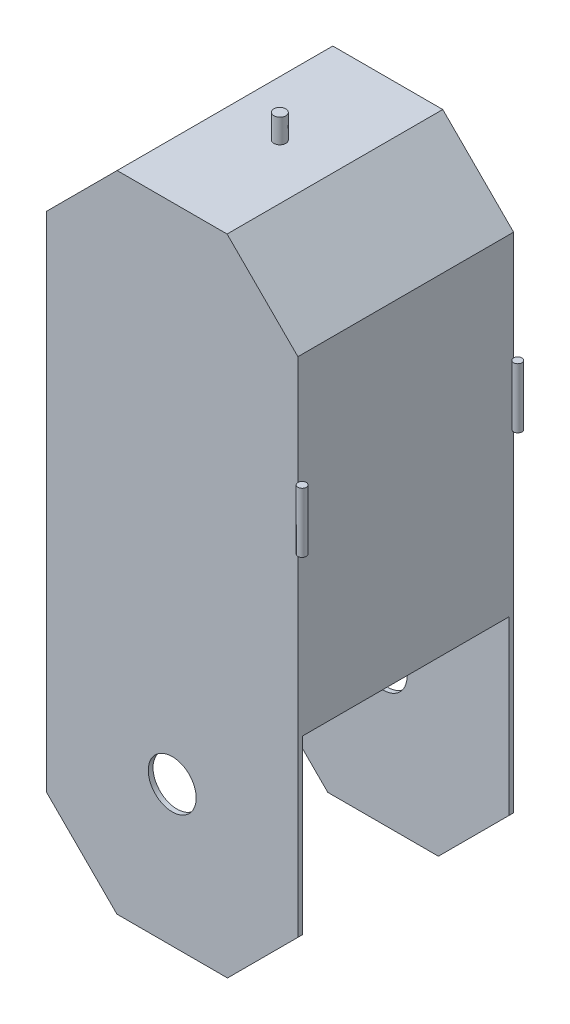
ISO-10303-21;
HEADER;
FILE_DESCRIPTION(('STEP AP214'),'2;1');
FILE_NAME('part.step','',(''),(''),'','','');
FILE_SCHEMA(('AUTOMOTIVE_DESIGN { 1 0 10303 214 1 1 1 1 }'));
ENDSEC;
DATA;
#1=APPLICATION_CONTEXT('core data for automotive mechanical design processes');
#2=APPLICATION_PROTOCOL_DEFINITION('international standard','automotive_design',2000,#1);
#3=PRODUCT_CONTEXT('',#1,'mechanical');
#4=PRODUCT('Part','Part','',(#3));
#5=PRODUCT_RELATED_PRODUCT_CATEGORY('part','',(#4));
#6=PRODUCT_DEFINITION_FORMATION('','',#4);
#7=PRODUCT_DEFINITION_CONTEXT('part definition',#1,'design');
#8=PRODUCT_DEFINITION('design','',#6,#7);
#9=PRODUCT_DEFINITION_SHAPE('','',#8);
#10=(LENGTH_UNIT() NAMED_UNIT(*) SI_UNIT(.MILLI.,.METRE.));
#11=(NAMED_UNIT(*) PLANE_ANGLE_UNIT() SI_UNIT($,.RADIAN.));
#12=(NAMED_UNIT(*) SI_UNIT($,.STERADIAN.) SOLID_ANGLE_UNIT());
#13=UNCERTAINTY_MEASURE_WITH_UNIT(LENGTH_MEASURE(1.E-05),#10,'distance_accuracy_value','');
#14=(GEOMETRIC_REPRESENTATION_CONTEXT(3) GLOBAL_UNCERTAINTY_ASSIGNED_CONTEXT((#13)) GLOBAL_UNIT_ASSIGNED_CONTEXT((#10,
#11,#12)) REPRESENTATION_CONTEXT('',''));
#15=CARTESIAN_POINT('',(0.,0.,0.));
#16=DIRECTION('',(0.,0.,1.));
#17=DIRECTION('',(1.,0.,0.));
#18=AXIS2_PLACEMENT_3D('',#15,#16,#17);
#19=CARTESIAN_POINT('',(108.582921558728,490.825947063665,180.));
#20=DIRECTION('',(0.,-1.,0.));
#21=DIRECTION('',(1.,0.,0.));
#22=AXIS2_PLACEMENT_3D('',#19,#20,#21);
#23=CYLINDRICAL_SURFACE('',#22,3.50000000000001);
#24=CARTESIAN_POINT('',(108.582921558728,490.825947063665,180.));
#25=DIRECTION('',(0.,1.,0.));
#26=DIRECTION('',(1.,0.,0.));
#27=AXIS2_PLACEMENT_3D('',#24,#25,#26);
#28=CIRCLE('',#27,3.50000000000001);
#29=CARTESIAN_POINT('',(112.082921558728,490.825947063665,180.));
#30=VERTEX_POINT('',#29);
#31=EDGE_CURVE('E11',#30,#30,#28,.T.);
#32=ORIENTED_EDGE('',*,*,#31,.F.);
#33=EDGE_LOOP('',(#32));
#34=FACE_BOUND('',#33,.T.);
#35=CARTESIAN_POINT('',(108.582921558728,440.825947063665,180.));
#36=DIRECTION('',(0.,1.,0.));
#37=DIRECTION('',(1.,0.,0.));
#38=AXIS2_PLACEMENT_3D('',#35,#36,#37);
#39=CIRCLE('',#38,3.50000000000001);
#40=CARTESIAN_POINT('',(112.082921558728,440.825947063665,180.));
#41=VERTEX_POINT('',#40);
#42=EDGE_CURVE('E42',#41,#41,#39,.T.);
#43=ORIENTED_EDGE('',*,*,#42,.T.);
#44=EDGE_LOOP('',(#43));
#45=FACE_BOUND('',#44,.T.);
#46=ADVANCED_FACE('F39',(#34,#45),#23,.T.);
#47=CARTESIAN_POINT('',(108.582921558728,490.825947063665,180.));
#48=DIRECTION('',(0.,-1.,0.));
#49=DIRECTION('',(1.,0.,0.));
#50=AXIS2_PLACEMENT_3D('',#47,#48,#49);
#51=PLANE('',#50);
#52=ORIENTED_EDGE('',*,*,#31,.T.);
#53=EDGE_LOOP('',(#52));
#54=FACE_BOUND('',#53,.T.);
#55=ADVANCED_FACE('F54',(#54),#51,.F.);
#56=CARTESIAN_POINT('',(108.582921558728,440.825947063665,180.));
#57=DIRECTION('',(0.,-1.,0.));
#58=DIRECTION('',(1.,0.,0.));
#59=AXIS2_PLACEMENT_3D('',#56,#57,#58);
#60=PLANE('',#59);
#61=ORIENTED_EDGE('',*,*,#42,.F.);
#62=EDGE_LOOP('',(#61));
#63=FACE_BOUND('',#62,.T.);
#64=ADVANCED_FACE('F52',(#63),#60,.T.);
#65=CLOSED_SHELL('',(#46,#55,#64));
#66=MANIFOLD_SOLID_BREP('B2',#65);
#67=CARTESIAN_POINT('',(108.582921558728,490.825947063665,0.));
#68=DIRECTION('',(0.,-1.,0.));
#69=DIRECTION('',(1.,0.,0.));
#70=AXIS2_PLACEMENT_3D('',#67,#68,#69);
#71=CYLINDRICAL_SURFACE('',#70,3.50000000000001);
#72=CARTESIAN_POINT('',(108.582921558728,490.825947063665,0.));
#73=DIRECTION('',(0.,1.,0.));
#74=DIRECTION('',(-1.,0.,0.));
#75=AXIS2_PLACEMENT_3D('',#72,#73,#74);
#76=CIRCLE('',#75,3.50000000000001);
#77=CARTESIAN_POINT('',(105.082921558728,490.825947063665,0.));
#78=VERTEX_POINT('',#77);
#79=EDGE_CURVE('E38',#78,#78,#76,.T.);
#80=ORIENTED_EDGE('',*,*,#79,.F.);
#81=EDGE_LOOP('',(#80));
#82=FACE_BOUND('',#81,.T.);
#83=CARTESIAN_POINT('',(108.582921558728,440.825947063665,0.));
#84=DIRECTION('',(0.,1.,0.));
#85=DIRECTION('',(-1.,0.,0.));
#86=AXIS2_PLACEMENT_3D('',#83,#84,#85);
#87=CIRCLE('',#86,3.50000000000001);
#88=CARTESIAN_POINT('',(105.082921558728,440.825947063665,0.));
#89=VERTEX_POINT('',#88);
#90=EDGE_CURVE('E91',#89,#89,#87,.T.);
#91=ORIENTED_EDGE('',*,*,#90,.T.);
#92=EDGE_LOOP('',(#91));
#93=FACE_BOUND('',#92,.T.);
#94=ADVANCED_FACE('F88',(#82,#93),#71,.T.);
#95=CARTESIAN_POINT('',(108.582921558728,490.825947063665,0.));
#96=DIRECTION('',(0.,1.,0.));
#97=DIRECTION('',(-1.,0.,0.));
#98=AXIS2_PLACEMENT_3D('',#95,#96,#97);
#99=PLANE('',#98);
#100=ORIENTED_EDGE('',*,*,#79,.T.);
#101=EDGE_LOOP('',(#100));
#102=FACE_BOUND('',#101,.T.);
#103=ADVANCED_FACE('F103',(#102),#99,.T.);
#104=CARTESIAN_POINT('',(108.582921558728,440.825947063665,0.));
#105=DIRECTION('',(0.,1.,0.));
#106=DIRECTION('',(-1.,0.,0.));
#107=AXIS2_PLACEMENT_3D('',#104,#105,#106);
#108=PLANE('',#107);
#109=ORIENTED_EDGE('',*,*,#90,.F.);
#110=EDGE_LOOP('',(#109));
#111=FACE_BOUND('',#110,.T.);
#112=ADVANCED_FACE('F101',(#111),#108,.F.);
#113=CLOSED_SHELL('',(#94,#103,#112));
#114=MANIFOLD_SOLID_BREP('B6',#113);
#115=CARTESIAN_POINT('',(45.9790427486258,640.825947063665,180.));
#116=DIRECTION('',(0.,-1.,0.));
#117=DIRECTION('',(1.,0.,0.));
#118=AXIS2_PLACEMENT_3D('',#115,#116,#117);
#119=PLANE('',#118);
#120=DIRECTION('',(-1.,0.,0.));
#121=VECTOR('',#120,1.);
#122=CARTESIAN_POINT('',(45.9790427486258,640.825947063665,0.));
#123=LINE('',#122,#121);
#124=CARTESIAN_POINT('',(45.9790427486258,640.825947063665,0.));
#125=VERTEX_POINT('',#124);
#126=CARTESIAN_POINT('',(-45.8131996311706,640.825947063664,0.));
#127=VERTEX_POINT('',#126);
#128=EDGE_CURVE('E245',#125,#127,#123,.T.);
#129=ORIENTED_EDGE('',*,*,#128,.T.);
#130=DIRECTION('',(0.,0.,-1.));
#131=VECTOR('',#130,1.);
#132=CARTESIAN_POINT('',(-45.8131996311706,640.825947063664,180.));
#133=LINE('',#132,#131);
#134=CARTESIAN_POINT('',(-45.8131996311706,640.825947063664,180.));
#135=VERTEX_POINT('',#134);
#136=EDGE_CURVE('E271',#135,#127,#133,.T.);
#137=ORIENTED_EDGE('',*,*,#136,.F.);
#138=DIRECTION('',(-1.,0.,0.));
#139=VECTOR('',#138,1.);
#140=CARTESIAN_POINT('',(45.9790427486258,640.825947063665,180.));
#141=LINE('',#140,#139);
#142=CARTESIAN_POINT('',(45.9790427486258,640.825947063665,180.));
#143=VERTEX_POINT('',#142);
#144=EDGE_CURVE('E333',#143,#135,#141,.T.);
#145=ORIENTED_EDGE('',*,*,#144,.F.);
#146=DIRECTION('',(0.,0.,-1.));
#147=VECTOR('',#146,1.);
#148=CARTESIAN_POINT('',(45.9790427486258,640.825947063665,180.));
#149=LINE('',#148,#147);
#150=EDGE_CURVE('E274',#143,#125,#149,.T.);
#151=ORIENTED_EDGE('',*,*,#150,.T.);
#152=EDGE_LOOP('',(#129,#137,#145,#151));
#153=FACE_BOUND('',#152,.T.);
#154=CARTESIAN_POINT('',(-7.75076087871991E-13,640.825947063665,90.));
#155=DIRECTION('',(0.,-1.,0.));
#156=DIRECTION('',(1.,0.,0.));
#157=AXIS2_PLACEMENT_3D('',#154,#155,#156);
#158=CIRCLE('',#157,5.);
#159=CARTESIAN_POINT('',(4.99999999999923,640.825947063665,90.));
#160=VERTEX_POINT('',#159);
#161=EDGE_CURVE('E86',#160,#160,#158,.F.);
#162=ORIENTED_EDGE('',*,*,#161,.F.);
#163=EDGE_LOOP('',(#162));
#164=FACE_BOUND('',#163,.T.);
#165=ADVANCED_FACE('F129',(#153,#164),#119,.F.);
#166=CARTESIAN_POINT('',(-104.917078441272,162.212880509357,180.));
#167=DIRECTION('',(0.707106781186547,0.707106781186547,0.));
#168=DIRECTION('',(-0.707106781186548,0.707106781186548,0.));
#169=AXIS2_PLACEMENT_3D('',#166,#167,#168);
#170=PLANE('',#169);
#171=DIRECTION('',(0.,0.,-1.));
#172=VECTOR('',#171,1.);
#173=CARTESIAN_POINT('',(-104.917078441272,162.212880509357,180.));
#174=LINE('',#173,#172);
#175=CARTESIAN_POINT('',(-104.917078441272,162.212880509357,180.));
#176=VERTEX_POINT('',#175);
#177=CARTESIAN_POINT('',(-104.917078441272,162.212880509357,176.));
#178=VERTEX_POINT('',#177);
#179=EDGE_CURVE('E266',#176,#178,#174,.T.);
#180=ORIENTED_EDGE('',*,*,#179,.T.);
#181=DIRECTION('',(0.707106781186548,-0.707106781186548,0.));
#182=VECTOR('',#181,1.);
#183=CARTESIAN_POINT('',(-104.917078441272,162.212880509357,176.));
#184=LINE('',#183,#182);
#185=CARTESIAN_POINT('',(-45.973174510304,103.268976578389,176.));
#186=VERTEX_POINT('',#185);
#187=EDGE_CURVE('E228',#178,#186,#184,.T.);
#188=ORIENTED_EDGE('',*,*,#187,.T.);
#189=DIRECTION('',(0.,0.,-1.));
#190=VECTOR('',#189,1.);
#191=CARTESIAN_POINT('',(-45.973174510304,103.268976578389,180.));
#192=LINE('',#191,#190);
#193=CARTESIAN_POINT('',(-45.973174510304,103.268976578389,180.));
#194=VERTEX_POINT('',#193);
#195=EDGE_CURVE('E225',#194,#186,#192,.T.);
#196=ORIENTED_EDGE('',*,*,#195,.F.);
#197=DIRECTION('',(0.707106781186547,-0.707106781186547,0.));
#198=VECTOR('',#197,1.);
#199=CARTESIAN_POINT('',(-104.917078441272,162.212880509357,180.));
#200=LINE('',#199,#198);
#201=EDGE_CURVE('E211',#176,#194,#200,.T.);
#202=ORIENTED_EDGE('',*,*,#201,.F.);
#203=EDGE_LOOP('',(#180,#188,#196,#202));
#204=FACE_BOUND('',#203,.T.);
#205=ADVANCED_FACE('F226',(#204),#170,.F.);
#206=CARTESIAN_POINT('',(-45.973174510304,103.268976578389,180.));
#207=DIRECTION('',(0.,1.,0.));
#208=DIRECTION('',(0.,0.,1.));
#209=AXIS2_PLACEMENT_3D('',#206,#207,#208);
#210=PLANE('',#209);
#211=ORIENTED_EDGE('',*,*,#195,.T.);
#212=DIRECTION('',(1.,0.,0.));
#213=VECTOR('',#212,1.);
#214=CARTESIAN_POINT('',(-45.973174510304,103.268976578389,176.));
#215=LINE('',#214,#213);
#216=CARTESIAN_POINT('',(46.326817336749,103.268976578389,176.));
#217=VERTEX_POINT('',#216);
#218=EDGE_CURVE('E328',#186,#217,#215,.T.);
#219=ORIENTED_EDGE('',*,*,#218,.T.);
#220=DIRECTION('',(0.,0.,-1.));
#221=VECTOR('',#220,1.);
#222=CARTESIAN_POINT('',(46.326817336749,103.268976578389,180.));
#223=LINE('',#222,#221);
#224=CARTESIAN_POINT('',(46.326817336749,103.268976578389,180.));
#225=VERTEX_POINT('',#224);
#226=EDGE_CURVE('E236',#225,#217,#223,.T.);
#227=ORIENTED_EDGE('',*,*,#226,.F.);
#228=DIRECTION('',(1.,0.,0.));
#229=VECTOR('',#228,1.);
#230=CARTESIAN_POINT('',(-45.973174510304,103.268976578389,180.));
#231=LINE('',#230,#229);
#232=EDGE_CURVE('E215',#194,#225,#231,.T.);
#233=ORIENTED_EDGE('',*,*,#232,.F.);
#234=EDGE_LOOP('',(#211,#219,#227,#233));
#235=FACE_BOUND('',#234,.T.);
#236=ADVANCED_FACE('F234',(#235),#210,.F.);
#237=CARTESIAN_POINT('',(46.326817336749,103.268976578389,180.));
#238=DIRECTION('',(-0.707106781186547,0.707106781186547,0.));
#239=DIRECTION('',(-0.707106781186548,-0.707106781186548,0.));
#240=AXIS2_PLACEMENT_3D('',#237,#238,#239);
#241=PLANE('',#240);
#242=ORIENTED_EDGE('',*,*,#226,.T.);
#243=DIRECTION('',(0.707106781186548,0.707106781186548,0.));
#244=VECTOR('',#243,1.);
#245=CARTESIAN_POINT('',(46.326817336749,103.268976578389,176.));
#246=LINE('',#245,#244);
#247=CARTESIAN_POINT('',(105.082921558728,162.025080800367,176.));
#248=VERTEX_POINT('',#247);
#249=EDGE_CURVE('E137',#217,#248,#246,.T.);
#250=ORIENTED_EDGE('',*,*,#249,.T.);
#251=DIRECTION('',(0.,0.,-1.));
#252=VECTOR('',#251,1.);
#253=CARTESIAN_POINT('',(105.082921558728,162.025080800368,180.));
#254=LINE('',#253,#252);
#255=CARTESIAN_POINT('',(105.082921558728,162.025080800368,180.));
#256=VERTEX_POINT('',#255);
#257=EDGE_CURVE('E261',#256,#248,#254,.T.);
#258=ORIENTED_EDGE('',*,*,#257,.F.);
#259=DIRECTION('',(0.707106781186547,0.707106781186548,0.));
#260=VECTOR('',#259,1.);
#261=CARTESIAN_POINT('',(46.326817336749,103.268976578389,180.));
#262=LINE('',#261,#260);
#263=EDGE_CURVE('E153',#225,#256,#262,.T.);
#264=ORIENTED_EDGE('',*,*,#263,.F.);
#265=EDGE_LOOP('',(#242,#250,#258,#264));
#266=FACE_BOUND('',#265,.T.);
#267=ADVANCED_FACE('F394',(#266),#241,.F.);
#268=CARTESIAN_POINT('',(105.082921558728,162.025080800368,180.));
#269=DIRECTION('',(-1.,0.,0.));
#270=DIRECTION('',(0.,-1.,0.));
#271=AXIS2_PLACEMENT_3D('',#268,#269,#270);
#272=PLANE('',#271);
#273=ORIENTED_EDGE('',*,*,#257,.T.);
#274=DIRECTION('',(0.,-1.,0.));
#275=VECTOR('',#274,1.);
#276=CARTESIAN_POINT('',(105.082921558728,96.7638285879703,176.));
#277=LINE('',#276,#275);
#278=CARTESIAN_POINT('',(105.082921558728,305.626166773163,176.));
#279=VERTEX_POINT('',#278);
#280=EDGE_CURVE('E289',#279,#248,#277,.T.);
#281=ORIENTED_EDGE('',*,*,#280,.F.);
#282=DIRECTION('',(0.,0.,1.));
#283=VECTOR('',#282,1.);
#284=CARTESIAN_POINT('',(105.082921558728,305.626166773163,176.));
#285=LINE('',#284,#283);
#286=CARTESIAN_POINT('',(105.082921558728,305.626166773163,4.));
#287=VERTEX_POINT('',#286);
#288=EDGE_CURVE('E305',#287,#279,#285,.T.);
#289=ORIENTED_EDGE('',*,*,#288,.F.);
#290=DIRECTION('',(0.,1.,0.));
#291=VECTOR('',#290,1.);
#292=CARTESIAN_POINT('',(105.082921558728,96.7638285879703,4.));
#293=LINE('',#292,#291);
#294=CARTESIAN_POINT('',(105.082921558728,162.025080800367,4.));
#295=VERTEX_POINT('',#294);
#296=EDGE_CURVE('E314',#295,#287,#293,.T.);
#297=ORIENTED_EDGE('',*,*,#296,.F.);
#298=CARTESIAN_POINT('',(105.082921558728,162.025080800368,0.));
#299=VERTEX_POINT('',#298);
#300=EDGE_CURVE('E187',#295,#299,#254,.T.);
#301=ORIENTED_EDGE('',*,*,#300,.T.);
#302=DIRECTION('',(0.,1.,0.));
#303=VECTOR('',#302,1.);
#304=CARTESIAN_POINT('',(105.082921558728,162.025080800368,0.));
#305=LINE('',#304,#303);
#306=CARTESIAN_POINT('',(105.082921558728,581.722068253563,0.));
#307=VERTEX_POINT('',#306);
#308=EDGE_CURVE('E241',#299,#307,#305,.T.);
#309=ORIENTED_EDGE('',*,*,#308,.T.);
#310=DIRECTION('',(0.,0.,-1.));
#311=VECTOR('',#310,1.);
#312=CARTESIAN_POINT('',(105.082921558728,581.722068253563,180.));
#313=LINE('',#312,#311);
#314=CARTESIAN_POINT('',(105.082921558728,581.722068253563,180.));
#315=VERTEX_POINT('',#314);
#316=EDGE_CURVE('E277',#315,#307,#313,.T.);
#317=ORIENTED_EDGE('',*,*,#316,.F.);
#318=DIRECTION('',(0.,1.,0.));
#319=VECTOR('',#318,1.);
#320=CARTESIAN_POINT('',(105.082921558728,162.025080800368,180.));
#321=LINE('',#320,#319);
#322=EDGE_CURVE('E260',#256,#315,#321,.T.);
#323=ORIENTED_EDGE('',*,*,#322,.F.);
#324=EDGE_LOOP('',(#273,#281,#289,#297,#301,#309,#317,#323));
#325=FACE_BOUND('',#324,.T.);
#326=ADVANCED_FACE('F131',(#325),#272,.F.);
#327=CARTESIAN_POINT('',(105.082921558728,581.722068253563,180.));
#328=DIRECTION('',(-0.707106781186548,-0.707106781186547,0.));
#329=DIRECTION('',(0.707106781186547,-0.707106781186548,0.));
#330=AXIS2_PLACEMENT_3D('',#327,#328,#329);
#331=PLANE('',#330);
#332=DIRECTION('',(-0.707106781186547,0.707106781186548,0.));
#333=VECTOR('',#332,1.);
#334=CARTESIAN_POINT('',(105.082921558728,581.722068253563,0.));
#335=LINE('',#334,#333);
#336=EDGE_CURVE('E243',#307,#125,#335,.T.);
#337=ORIENTED_EDGE('',*,*,#336,.T.);
#338=ORIENTED_EDGE('',*,*,#150,.F.);
#339=DIRECTION('',(-0.707106781186547,0.707106781186548,0.));
#340=VECTOR('',#339,1.);
#341=CARTESIAN_POINT('',(105.082921558728,581.722068253563,180.));
#342=LINE('',#341,#340);
#343=EDGE_CURVE('E196',#315,#143,#342,.T.);
#344=ORIENTED_EDGE('',*,*,#343,.F.);
#345=ORIENTED_EDGE('',*,*,#316,.T.);
#346=EDGE_LOOP('',(#337,#338,#344,#345));
#347=FACE_BOUND('',#346,.T.);
#348=ADVANCED_FACE('F396',(#347),#331,.F.);
#349=CARTESIAN_POINT('',(-45.8131996311706,640.825947063664,180.));
#350=DIRECTION('',(0.707106781186548,-0.707106781186547,0.));
#351=DIRECTION('',(0.707106781186547,0.707106781186548,0.));
#352=AXIS2_PLACEMENT_3D('',#349,#350,#351);
#353=PLANE('',#352);
#354=DIRECTION('',(-0.707106781186547,-0.707106781186548,0.));
#355=VECTOR('',#354,1.);
#356=CARTESIAN_POINT('',(-45.8131996311706,640.825947063664,0.));
#357=LINE('',#356,#355);
#358=CARTESIAN_POINT('',(-104.917078441272,581.722068253563,0.));
#359=VERTEX_POINT('',#358);
#360=EDGE_CURVE('E247',#127,#359,#357,.T.);
#361=ORIENTED_EDGE('',*,*,#360,.T.);
#362=DIRECTION('',(0.,0.,-1.));
#363=VECTOR('',#362,1.);
#364=CARTESIAN_POINT('',(-104.917078441272,581.722068253563,180.));
#365=LINE('',#364,#363);
#366=CARTESIAN_POINT('',(-104.917078441272,581.722068253563,180.));
#367=VERTEX_POINT('',#366);
#368=EDGE_CURVE('E268',#367,#359,#365,.T.);
#369=ORIENTED_EDGE('',*,*,#368,.F.);
#370=DIRECTION('',(-0.707106781186547,-0.707106781186548,0.));
#371=VECTOR('',#370,1.);
#372=CARTESIAN_POINT('',(-45.8131996311706,640.825947063664,180.));
#373=LINE('',#372,#371);
#374=EDGE_CURVE('E335',#135,#367,#373,.T.);
#375=ORIENTED_EDGE('',*,*,#374,.F.);
#376=ORIENTED_EDGE('',*,*,#136,.T.);
#377=EDGE_LOOP('',(#361,#369,#375,#376));
#378=FACE_BOUND('',#377,.T.);
#379=ADVANCED_FACE('F341',(#378),#353,.F.);
#380=CARTESIAN_POINT('',(-104.917078441272,581.722068253563,180.));
#381=DIRECTION('',(1.,0.,0.));
#382=DIRECTION('',(0.,1.,0.));
#383=AXIS2_PLACEMENT_3D('',#380,#381,#382);
#384=PLANE('',#383);
#385=DIRECTION('',(0.,0.,1.));
#386=VECTOR('',#385,1.);
#387=CARTESIAN_POINT('',(-104.917078441272,305.626166773163,176.));
#388=LINE('',#387,#386);
#389=CARTESIAN_POINT('',(-104.917078441272,305.626166773163,4.));
#390=VERTEX_POINT('',#389);
#391=CARTESIAN_POINT('',(-104.917078441272,305.626166773163,176.));
#392=VERTEX_POINT('',#391);
#393=EDGE_CURVE('E308',#390,#392,#388,.T.);
#394=ORIENTED_EDGE('',*,*,#393,.T.);
#395=DIRECTION('',(0.,-1.,0.));
#396=VECTOR('',#395,1.);
#397=CARTESIAN_POINT('',(-104.917078441272,96.7638285879702,176.));
#398=LINE('',#397,#396);
#399=EDGE_CURVE('E301',#392,#178,#398,.T.);
#400=ORIENTED_EDGE('',*,*,#399,.T.);
#401=ORIENTED_EDGE('',*,*,#179,.F.);
#402=DIRECTION('',(0.,-1.,0.));
#403=VECTOR('',#402,1.);
#404=CARTESIAN_POINT('',(-104.917078441272,581.722068253563,180.));
#405=LINE('',#404,#403);
#406=EDGE_CURVE('E218',#367,#176,#405,.T.);
#407=ORIENTED_EDGE('',*,*,#406,.F.);
#408=ORIENTED_EDGE('',*,*,#368,.T.);
#409=DIRECTION('',(0.,-1.,0.));
#410=VECTOR('',#409,1.);
#411=CARTESIAN_POINT('',(-104.917078441272,581.722068253563,0.));
#412=LINE('',#411,#410);
#413=CARTESIAN_POINT('',(-104.917078441272,162.212880509357,0.));
#414=VERTEX_POINT('',#413);
#415=EDGE_CURVE('E249',#359,#414,#412,.T.);
#416=ORIENTED_EDGE('',*,*,#415,.T.);
#417=CARTESIAN_POINT('',(-104.917078441272,162.212880509357,4.));
#418=VERTEX_POINT('',#417);
#419=EDGE_CURVE('E231',#418,#414,#174,.T.);
#420=ORIENTED_EDGE('',*,*,#419,.F.);
#421=DIRECTION('',(0.,1.,0.));
#422=VECTOR('',#421,1.);
#423=CARTESIAN_POINT('',(-104.917078441272,96.7638285879702,4.));
#424=LINE('',#423,#422);
#425=EDGE_CURVE('E304',#418,#390,#424,.T.);
#426=ORIENTED_EDGE('',*,*,#425,.T.);
#427=EDGE_LOOP('',(#394,#400,#401,#407,#408,#416,#420,#426));
#428=FACE_BOUND('',#427,.T.);
#429=ADVANCED_FACE('F345',(#428),#384,.F.);
#430=CARTESIAN_POINT('',(-45.973174510304,103.268976578389,4.));
#431=VERTEX_POINT('',#430);
#432=CARTESIAN_POINT('',(-45.973174510304,103.268976578389,0.));
#433=VERTEX_POINT('',#432);
#434=EDGE_CURVE('E232',#431,#433,#192,.T.);
#435=ORIENTED_EDGE('',*,*,#434,.F.);
#436=DIRECTION('',(-0.707106781186548,0.707106781186548,0.));
#437=VECTOR('',#436,1.);
#438=CARTESIAN_POINT('',(-104.917078441272,162.212880509357,4.));
#439=LINE('',#438,#437);
#440=EDGE_CURVE('E325',#431,#418,#439,.T.);
#441=ORIENTED_EDGE('',*,*,#440,.T.);
#442=ORIENTED_EDGE('',*,*,#419,.T.);
#443=DIRECTION('',(0.707106781186547,-0.707106781186547,0.));
#444=VECTOR('',#443,1.);
#445=CARTESIAN_POINT('',(-104.917078441272,162.212880509357,0.));
#446=LINE('',#445,#444);
#447=EDGE_CURVE('E252',#414,#433,#446,.T.);
#448=ORIENTED_EDGE('',*,*,#447,.T.);
#449=EDGE_LOOP('',(#435,#441,#442,#448));
#450=FACE_BOUND('',#449,.T.);
#451=ADVANCED_FACE('F381',(#450),#170,.F.);
#452=CARTESIAN_POINT('',(46.326817336749,103.268976578389,4.00000000000006));
#453=VERTEX_POINT('',#452);
#454=CARTESIAN_POINT('',(46.326817336749,103.268976578389,0.));
#455=VERTEX_POINT('',#454);
#456=EDGE_CURVE('E264',#453,#455,#223,.T.);
#457=ORIENTED_EDGE('',*,*,#456,.F.);
#458=DIRECTION('',(-1.,0.,0.));
#459=VECTOR('',#458,1.);
#460=CARTESIAN_POINT('',(-45.973174510304,103.268976578389,4.));
#461=LINE('',#460,#459);
#462=EDGE_CURVE('E144',#453,#431,#461,.T.);
#463=ORIENTED_EDGE('',*,*,#462,.T.);
#464=ORIENTED_EDGE('',*,*,#434,.T.);
#465=DIRECTION('',(1.,0.,0.));
#466=VECTOR('',#465,1.);
#467=CARTESIAN_POINT('',(-45.973174510304,103.268976578389,0.));
#468=LINE('',#467,#466);
#469=EDGE_CURVE('E255',#433,#455,#468,.T.);
#470=ORIENTED_EDGE('',*,*,#469,.T.);
#471=EDGE_LOOP('',(#457,#463,#464,#470));
#472=FACE_BOUND('',#471,.T.);
#473=ADVANCED_FACE('F385',(#472),#210,.F.);
#474=ORIENTED_EDGE('',*,*,#300,.F.);
#475=DIRECTION('',(-0.707106781186548,-0.707106781186548,0.));
#476=VECTOR('',#475,1.);
#477=CARTESIAN_POINT('',(46.326817336749,103.268976578389,4.));
#478=LINE('',#477,#476);
#479=EDGE_CURVE('E279',#295,#453,#478,.T.);
#480=ORIENTED_EDGE('',*,*,#479,.T.);
#481=ORIENTED_EDGE('',*,*,#456,.T.);
#482=DIRECTION('',(0.707106781186547,0.707106781186548,0.));
#483=VECTOR('',#482,1.);
#484=CARTESIAN_POINT('',(46.326817336749,103.268976578389,0.));
#485=LINE('',#484,#483);
#486=EDGE_CURVE('E258',#455,#299,#485,.T.);
#487=ORIENTED_EDGE('',*,*,#486,.T.);
#488=EDGE_LOOP('',(#474,#480,#481,#487));
#489=FACE_BOUND('',#488,.T.);
#490=ADVANCED_FACE('F388',(#489),#241,.F.);
#491=CARTESIAN_POINT('',(105.082921558728,640.825947063665,180.));
#492=DIRECTION('',(0.,0.,1.));
#493=DIRECTION('',(1.,0.,0.));
#494=AXIS2_PLACEMENT_3D('',#491,#492,#493);
#495=PLANE('',#494);
#496=CARTESIAN_POINT('',(0.176821413222499,220.268976578389,180.));
#497=DIRECTION('',(0.,0.,-1.));
#498=DIRECTION('',(-1.,0.,0.));
#499=AXIS2_PLACEMENT_3D('',#496,#497,#498);
#500=CIRCLE('',#499,20.);
#501=CARTESIAN_POINT('',(-19.8231785867775,220.268976578389,180.));
#502=VERTEX_POINT('',#501);
#503=EDGE_CURVE('E285',#502,#502,#500,.T.);
#504=ORIENTED_EDGE('',*,*,#503,.T.);
#505=EDGE_LOOP('',(#504));
#506=FACE_BOUND('',#505,.T.);
#507=ORIENTED_EDGE('',*,*,#322,.T.);
#508=ORIENTED_EDGE('',*,*,#343,.T.);
#509=ORIENTED_EDGE('',*,*,#144,.T.);
#510=ORIENTED_EDGE('',*,*,#374,.T.);
#511=ORIENTED_EDGE('',*,*,#406,.T.);
#512=ORIENTED_EDGE('',*,*,#201,.T.);
#513=ORIENTED_EDGE('',*,*,#232,.T.);
#514=ORIENTED_EDGE('',*,*,#263,.T.);
#515=EDGE_LOOP('',(#507,#508,#509,#510,#511,#512,#513,#514));
#516=FACE_BOUND('',#515,.T.);
#517=ADVANCED_FACE('F213',(#506,#516),#495,.T.);
#518=CARTESIAN_POINT('',(105.082921558728,640.825947063665,0.));
#519=DIRECTION('',(0.,0.,1.));
#520=DIRECTION('',(1.,0.,0.));
#521=AXIS2_PLACEMENT_3D('',#518,#519,#520);
#522=PLANE('',#521);
#523=CARTESIAN_POINT('',(0.176821413222499,220.268976578389,0.));
#524=DIRECTION('',(0.,0.,-1.));
#525=DIRECTION('',(-1.,0.,0.));
#526=AXIS2_PLACEMENT_3D('',#523,#524,#525);
#527=CIRCLE('',#526,20.);
#528=CARTESIAN_POINT('',(-19.8231785867775,220.268976578389,0.));
#529=VERTEX_POINT('',#528);
#530=EDGE_CURVE('E292',#529,#529,#527,.T.);
#531=ORIENTED_EDGE('',*,*,#530,.F.);
#532=EDGE_LOOP('',(#531));
#533=FACE_BOUND('',#532,.T.);
#534=ORIENTED_EDGE('',*,*,#308,.F.);
#535=ORIENTED_EDGE('',*,*,#486,.F.);
#536=ORIENTED_EDGE('',*,*,#469,.F.);
#537=ORIENTED_EDGE('',*,*,#447,.F.);
#538=ORIENTED_EDGE('',*,*,#415,.F.);
#539=ORIENTED_EDGE('',*,*,#360,.F.);
#540=ORIENTED_EDGE('',*,*,#128,.F.);
#541=ORIENTED_EDGE('',*,*,#336,.F.);
#542=EDGE_LOOP('',(#534,#535,#536,#537,#538,#539,#540,#541));
#543=FACE_BOUND('',#542,.T.);
#544=ADVANCED_FACE('F401',(#533,#543),#522,.F.);
#545=CARTESIAN_POINT('',(-104.917078441272,96.7638285879702,176.));
#546=DIRECTION('',(0.,0.,1.));
#547=DIRECTION('',(1.,0.,0.));
#548=AXIS2_PLACEMENT_3D('',#545,#546,#547);
#549=PLANE('',#548);
#550=CARTESIAN_POINT('',(0.176821413222499,220.268976578389,176.));
#551=DIRECTION('',(0.,0.,1.));
#552=DIRECTION('',(1.,0.,0.));
#553=AXIS2_PLACEMENT_3D('',#550,#551,#552);
#554=CIRCLE('',#553,20.);
#555=CARTESIAN_POINT('',(-19.8231785867775,220.268976578389,176.));
#556=VERTEX_POINT('',#555);
#557=EDGE_CURVE('E284',#556,#556,#554,.T.);
#558=ORIENTED_EDGE('',*,*,#557,.T.);
#559=EDGE_LOOP('',(#558));
#560=FACE_BOUND('',#559,.T.);
#561=ORIENTED_EDGE('',*,*,#399,.F.);
#562=DIRECTION('',(1.,0.,0.));
#563=VECTOR('',#562,1.);
#564=CARTESIAN_POINT('',(-104.917078441272,305.626166773163,176.));
#565=LINE('',#564,#563);
#566=EDGE_CURVE('E319',#392,#279,#565,.T.);
#567=ORIENTED_EDGE('',*,*,#566,.T.);
#568=ORIENTED_EDGE('',*,*,#280,.T.);
#569=ORIENTED_EDGE('',*,*,#249,.F.);
#570=ORIENTED_EDGE('',*,*,#218,.F.);
#571=ORIENTED_EDGE('',*,*,#187,.F.);
#572=EDGE_LOOP('',(#561,#567,#568,#569,#570,#571));
#573=FACE_BOUND('',#572,.T.);
#574=ADVANCED_FACE('F392',(#560,#573),#549,.F.);
#575=CARTESIAN_POINT('',(-104.917078441272,96.7638285879702,4.));
#576=DIRECTION('',(0.,0.,-1.));
#577=DIRECTION('',(-1.,0.,0.));
#578=AXIS2_PLACEMENT_3D('',#575,#576,#577);
#579=PLANE('',#578);
#580=CARTESIAN_POINT('',(0.176821413222499,220.268976578389,4.));
#581=DIRECTION('',(0.,0.,-1.));
#582=DIRECTION('',(-1.,0.,0.));
#583=AXIS2_PLACEMENT_3D('',#580,#581,#582);
#584=CIRCLE('',#583,20.);
#585=CARTESIAN_POINT('',(-19.8231785867775,220.268976578389,4.00000000000003));
#586=VERTEX_POINT('',#585);
#587=EDGE_CURVE('E282',#586,#586,#584,.T.);
#588=ORIENTED_EDGE('',*,*,#587,.T.);
#589=EDGE_LOOP('',(#588));
#590=FACE_BOUND('',#589,.T.);
#591=ORIENTED_EDGE('',*,*,#462,.F.);
#592=ORIENTED_EDGE('',*,*,#479,.F.);
#593=ORIENTED_EDGE('',*,*,#296,.T.);
#594=DIRECTION('',(1.,0.,0.));
#595=VECTOR('',#594,1.);
#596=CARTESIAN_POINT('',(-104.917078441272,305.626166773163,4.));
#597=LINE('',#596,#595);
#598=EDGE_CURVE('E311',#390,#287,#597,.T.);
#599=ORIENTED_EDGE('',*,*,#598,.F.);
#600=ORIENTED_EDGE('',*,*,#425,.F.);
#601=ORIENTED_EDGE('',*,*,#440,.F.);
#602=EDGE_LOOP('',(#591,#592,#593,#599,#600,#601));
#603=FACE_BOUND('',#602,.T.);
#604=ADVANCED_FACE('F373',(#590,#603),#579,.F.);
#605=CARTESIAN_POINT('',(-104.917078441272,305.626166773163,176.));
#606=DIRECTION('',(0.,1.,0.));
#607=DIRECTION('',(-1.,0.,0.));
#608=AXIS2_PLACEMENT_3D('',#605,#606,#607);
#609=PLANE('',#608);
#610=ORIENTED_EDGE('',*,*,#288,.T.);
#611=ORIENTED_EDGE('',*,*,#566,.F.);
#612=ORIENTED_EDGE('',*,*,#393,.F.);
#613=ORIENTED_EDGE('',*,*,#598,.T.);
#614=EDGE_LOOP('',(#610,#611,#612,#613));
#615=FACE_BOUND('',#614,.T.);
#616=ADVANCED_FACE('F376',(#615),#609,.F.);
#617=CARTESIAN_POINT('',(0.176821413222499,220.268976578389,180.));
#618=DIRECTION('',(0.,0.,-1.));
#619=DIRECTION('',(-1.,0.,0.));
#620=AXIS2_PLACEMENT_3D('',#617,#618,#619);
#621=CYLINDRICAL_SURFACE('',#620,20.);
#622=CARTESIAN_POINT('',(-19.8231785867775,220.268976578389,0.));
#623=CARTESIAN_POINT('',(-19.8231785867775,220.268976578389,0.0416666666666898));
#624=CARTESIAN_POINT('',(-19.8231785867775,220.268976578389,0.0833333333333519));
#625=CARTESIAN_POINT('',(-19.8231785867775,220.268976578389,0.166666666666685));
#626=CARTESIAN_POINT('',(-19.8231785867775,220.268976578389,0.208333333333357));
#627=CARTESIAN_POINT('',(-19.8231785867775,220.268976578389,0.291666666666699));
#628=CARTESIAN_POINT('',(-19.8231785867775,220.268976578389,0.333333333333371));
#629=CARTESIAN_POINT('',(-19.8231785867775,220.268976578389,0.416666666666704));
#630=CARTESIAN_POINT('',(-19.8231785867775,220.268976578389,0.458333333333366));
#631=CARTESIAN_POINT('',(-19.8231785867775,220.268976578389,0.54166666666669));
#632=CARTESIAN_POINT('',(-19.8231785867775,220.268976578389,0.583333333333352));
#633=CARTESIAN_POINT('',(-19.8231785867775,220.268976578389,0.666666666666686));
#634=CARTESIAN_POINT('',(-19.8231785867775,220.268976578389,0.708333333333357));
#635=CARTESIAN_POINT('',(-19.8231785867775,220.268976578389,0.7916666666667));
#636=CARTESIAN_POINT('',(-19.8231785867775,220.268976578389,0.833333333333371));
#637=CARTESIAN_POINT('',(-19.8231785867775,220.268976578389,0.916666666666704));
#638=CARTESIAN_POINT('',(-19.8231785867775,220.268976578389,0.958333333333367));
#639=CARTESIAN_POINT('',(-19.8231785867775,220.268976578389,1.04166666666669));
#640=CARTESIAN_POINT('',(-19.8231785867775,220.268976578389,1.08333333333335));
#641=CARTESIAN_POINT('',(-19.8231785867775,220.268976578389,1.16666666666669));
#642=CARTESIAN_POINT('',(-19.8231785867775,220.268976578389,1.20833333333336));
#643=CARTESIAN_POINT('',(-19.8231785867775,220.268976578389,1.2916666666667));
#644=CARTESIAN_POINT('',(-19.8231785867775,220.268976578389,1.33333333333337));
#645=CARTESIAN_POINT('',(-19.8231785867775,220.268976578389,1.4166666666667));
#646=CARTESIAN_POINT('',(-19.8231785867775,220.268976578389,1.45833333333337));
#647=CARTESIAN_POINT('',(-19.8231785867775,220.268976578389,1.54166666666669));
#648=CARTESIAN_POINT('',(-19.8231785867775,220.268976578389,1.58333333333335));
#649=CARTESIAN_POINT('',(-19.8231785867775,220.268976578389,1.66666666666669));
#650=CARTESIAN_POINT('',(-19.8231785867775,220.268976578389,1.70833333333336));
#651=CARTESIAN_POINT('',(-19.8231785867775,220.268976578389,1.7916666666667));
#652=CARTESIAN_POINT('',(-19.8231785867775,220.268976578389,1.83333333333337));
#653=CARTESIAN_POINT('',(-19.8231785867775,220.268976578389,1.91666666666671));
#654=CARTESIAN_POINT('',(-19.8231785867775,220.268976578389,1.95833333333337));
#655=CARTESIAN_POINT('',(-19.8231785867775,220.268976578389,2.04166666666669));
#656=CARTESIAN_POINT('',(-19.8231785867775,220.268976578389,2.08333333333335));
#657=CARTESIAN_POINT('',(-19.8231785867775,220.268976578389,2.16666666666669));
#658=CARTESIAN_POINT('',(-19.8231785867775,220.268976578389,2.20833333333336));
#659=CARTESIAN_POINT('',(-19.8231785867775,220.268976578389,2.2916666666667));
#660=CARTESIAN_POINT('',(-19.8231785867775,220.268976578389,2.33333333333337));
#661=CARTESIAN_POINT('',(-19.8231785867775,220.268976578389,2.41666666666671));
#662=CARTESIAN_POINT('',(-19.8231785867775,220.268976578389,2.45833333333337));
#663=CARTESIAN_POINT('',(-19.8231785867775,220.268976578389,2.54166666666669));
#664=CARTESIAN_POINT('',(-19.8231785867775,220.268976578389,2.58333333333335));
#665=CARTESIAN_POINT('',(-19.8231785867775,220.268976578389,2.66666666666669));
#666=CARTESIAN_POINT('',(-19.8231785867775,220.268976578389,2.70833333333336));
#667=CARTESIAN_POINT('',(-19.8231785867775,220.268976578389,2.7916666666667));
#668=CARTESIAN_POINT('',(-19.8231785867775,220.268976578389,2.83333333333337));
#669=CARTESIAN_POINT('',(-19.8231785867775,220.268976578389,2.91666666666671));
#670=CARTESIAN_POINT('',(-19.8231785867775,220.268976578389,2.95833333333337));
#671=CARTESIAN_POINT('',(-19.8231785867775,220.268976578389,3.04166666666669));
#672=CARTESIAN_POINT('',(-19.8231785867775,220.268976578389,3.08333333333335));
#673=CARTESIAN_POINT('',(-19.8231785867775,220.268976578389,3.16666666666669));
#674=CARTESIAN_POINT('',(-19.8231785867775,220.268976578389,3.20833333333336));
#675=CARTESIAN_POINT('',(-19.8231785867775,220.268976578389,3.2916666666667));
#676=CARTESIAN_POINT('',(-19.8231785867775,220.268976578389,3.33333333333337));
#677=CARTESIAN_POINT('',(-19.8231785867775,220.268976578389,3.41666666666671));
#678=CARTESIAN_POINT('',(-19.8231785867775,220.268976578389,3.45833333333337));
#679=CARTESIAN_POINT('',(-19.8231785867775,220.268976578389,3.54166666666669));
#680=CARTESIAN_POINT('',(-19.8231785867775,220.268976578389,3.58333333333336));
#681=CARTESIAN_POINT('',(-19.8231785867775,220.268976578389,3.66666666666669));
#682=CARTESIAN_POINT('',(-19.8231785867775,220.268976578389,3.70833333333336));
#683=CARTESIAN_POINT('',(-19.8231785867775,220.268976578389,3.7916666666667));
#684=CARTESIAN_POINT('',(-19.8231785867775,220.268976578389,3.83333333333337));
#685=CARTESIAN_POINT('',(-19.8231785867775,220.268976578389,3.91666666666671));
#686=CARTESIAN_POINT('',(-19.8231785867775,220.268976578389,3.95833333333337));
#687=CARTESIAN_POINT('',(-19.8231785867775,220.268976578389,4.00000000000003));
#688=B_SPLINE_CURVE_WITH_KNOTS('',3,(#622,#623,#624,#625,#626,#627,#628,#629,#630,#631,#632,
#633,#634,#635,#636,#637,#638,#639,#640,#641,#642,#643,#644,#645,#646,#647,#648,#649,#650,#651,
#652,#653,#654,#655,#656,#657,#658,#659,#660,#661,#662,#663,#664,#665,#666,#667,#668,#669,#670,
#671,#672,#673,#674,#675,#676,#677,#678,#679,#680,#681,#682,#683,#684,#685,#686,#687),
.UNSPECIFIED.,.F.,.F.,(4,2,2,2,2,2,2,2,2,2,2,2,2,2,2,2,2,2,2,2,2,2,2,2,2,2,2,2,2,2,2,2,4),(0.,
0.124999999999986,0.25,0.375000000000014,0.5,0.624999999999987,0.750000000000001,
0.875000000000015,1.,1.12499999999999,1.25,1.37500000000002,1.5,1.62499999999999,1.75,
1.87500000000002,2.,2.12499999999999,2.25,2.37500000000002,2.5,2.62499999999999,2.75,
2.87500000000002,3.,3.12499999999999,3.25,3.37500000000002,3.5,3.62499999999999,3.75,
3.87500000000002,4.),.UNSPECIFIED.);
#689=EDGE_CURVE('BSEAM470',#529,#586,#688,.T.);
#690=ORIENTED_EDGE('',*,*,#530,.T.);
#691=ORIENTED_EDGE('',*,*,#587,.F.);
#692=ORIENTED_EDGE('',*,*,#689,.T.);
#693=ORIENTED_EDGE('',*,*,#689,.F.);
#694=EDGE_LOOP('',(#690,#692,#691,#693));
#695=FACE_BOUND('',#694,.T.);
#696=ADVANCED_FACE('F470',(#695),#621,.F.);
#697=CARTESIAN_POINT('',(-19.8231785867775,220.268976578389,180.));
#698=CARTESIAN_POINT('',(-19.8231785867775,220.268976578389,179.958333333333));
#699=CARTESIAN_POINT('',(-19.8231785867775,220.268976578389,179.916666666667));
#700=CARTESIAN_POINT('',(-19.8231785867775,220.268976578389,179.833333333333));
#701=CARTESIAN_POINT('',(-19.8231785867775,220.268976578389,179.791666666667));
#702=CARTESIAN_POINT('',(-19.8231785867775,220.268976578389,179.708333333333));
#703=CARTESIAN_POINT('',(-19.8231785867775,220.268976578389,179.666666666667));
#704=CARTESIAN_POINT('',(-19.8231785867775,220.268976578389,179.583333333333));
#705=CARTESIAN_POINT('',(-19.8231785867775,220.268976578389,179.541666666667));
#706=CARTESIAN_POINT('',(-19.8231785867775,220.268976578389,179.458333333333));
#707=CARTESIAN_POINT('',(-19.8231785867775,220.268976578389,179.416666666667));
#708=CARTESIAN_POINT('',(-19.8231785867775,220.268976578389,179.333333333333));
#709=CARTESIAN_POINT('',(-19.8231785867775,220.268976578389,179.291666666667));
#710=CARTESIAN_POINT('',(-19.8231785867775,220.268976578389,179.208333333333));
#711=CARTESIAN_POINT('',(-19.8231785867775,220.268976578389,179.166666666667));
#712=CARTESIAN_POINT('',(-19.8231785867775,220.268976578389,179.083333333333));
#713=CARTESIAN_POINT('',(-19.8231785867775,220.268976578389,179.041666666667));
#714=CARTESIAN_POINT('',(-19.8231785867775,220.268976578389,178.958333333333));
#715=CARTESIAN_POINT('',(-19.8231785867775,220.268976578389,178.916666666667));
#716=CARTESIAN_POINT('',(-19.8231785867775,220.268976578389,178.833333333333));
#717=CARTESIAN_POINT('',(-19.8231785867775,220.268976578389,178.791666666667));
#718=CARTESIAN_POINT('',(-19.8231785867775,220.268976578389,178.708333333333));
#719=CARTESIAN_POINT('',(-19.8231785867775,220.268976578389,178.666666666667));
#720=CARTESIAN_POINT('',(-19.8231785867775,220.268976578389,178.583333333333));
#721=CARTESIAN_POINT('',(-19.8231785867775,220.268976578389,178.541666666667));
#722=CARTESIAN_POINT('',(-19.8231785867775,220.268976578389,178.458333333333));
#723=CARTESIAN_POINT('',(-19.8231785867775,220.268976578389,178.416666666667));
#724=CARTESIAN_POINT('',(-19.8231785867775,220.268976578389,178.333333333333));
#725=CARTESIAN_POINT('',(-19.8231785867775,220.268976578389,178.291666666667));
#726=CARTESIAN_POINT('',(-19.8231785867775,220.268976578389,178.208333333333));
#727=CARTESIAN_POINT('',(-19.8231785867775,220.268976578389,178.166666666667));
#728=CARTESIAN_POINT('',(-19.8231785867775,220.268976578389,178.083333333333));
#729=CARTESIAN_POINT('',(-19.8231785867775,220.268976578389,178.041666666667));
#730=CARTESIAN_POINT('',(-19.8231785867775,220.268976578389,177.958333333333));
#731=CARTESIAN_POINT('',(-19.8231785867775,220.268976578389,177.916666666667));
#732=CARTESIAN_POINT('',(-19.8231785867775,220.268976578389,177.833333333333));
#733=CARTESIAN_POINT('',(-19.8231785867775,220.268976578389,177.791666666667));
#734=CARTESIAN_POINT('',(-19.8231785867775,220.268976578389,177.708333333333));
#735=CARTESIAN_POINT('',(-19.8231785867775,220.268976578389,177.666666666667));
#736=CARTESIAN_POINT('',(-19.8231785867775,220.268976578389,177.583333333333));
#737=CARTESIAN_POINT('',(-19.8231785867775,220.268976578389,177.541666666667));
#738=CARTESIAN_POINT('',(-19.8231785867775,220.268976578389,177.458333333333));
#739=CARTESIAN_POINT('',(-19.8231785867775,220.268976578389,177.416666666667));
#740=CARTESIAN_POINT('',(-19.8231785867775,220.268976578389,177.333333333333));
#741=CARTESIAN_POINT('',(-19.8231785867775,220.268976578389,177.291666666667));
#742=CARTESIAN_POINT('',(-19.8231785867775,220.268976578389,177.208333333333));
#743=CARTESIAN_POINT('',(-19.8231785867775,220.268976578389,177.166666666667));
#744=CARTESIAN_POINT('',(-19.8231785867775,220.268976578389,177.083333333333));
#745=CARTESIAN_POINT('',(-19.8231785867775,220.268976578389,177.041666666667));
#746=CARTESIAN_POINT('',(-19.8231785867775,220.268976578389,176.958333333333));
#747=CARTESIAN_POINT('',(-19.8231785867775,220.268976578389,176.916666666667));
#748=CARTESIAN_POINT('',(-19.8231785867775,220.268976578389,176.833333333333));
#749=CARTESIAN_POINT('',(-19.8231785867775,220.268976578389,176.791666666667));
#750=CARTESIAN_POINT('',(-19.8231785867775,220.268976578389,176.708333333333));
#751=CARTESIAN_POINT('',(-19.8231785867775,220.268976578389,176.666666666667));
#752=CARTESIAN_POINT('',(-19.8231785867775,220.268976578389,176.583333333333));
#753=CARTESIAN_POINT('',(-19.8231785867775,220.268976578389,176.541666666667));
#754=CARTESIAN_POINT('',(-19.8231785867775,220.268976578389,176.458333333333));
#755=CARTESIAN_POINT('',(-19.8231785867775,220.268976578389,176.416666666667));
#756=CARTESIAN_POINT('',(-19.8231785867775,220.268976578389,176.333333333333));
#757=CARTESIAN_POINT('',(-19.8231785867775,220.268976578389,176.291666666667));
#758=CARTESIAN_POINT('',(-19.8231785867775,220.268976578389,176.208333333333));
#759=CARTESIAN_POINT('',(-19.8231785867775,220.268976578389,176.166666666667));
#760=CARTESIAN_POINT('',(-19.8231785867775,220.268976578389,176.083333333333));
#761=CARTESIAN_POINT('',(-19.8231785867775,220.268976578389,176.041666666667));
#762=CARTESIAN_POINT('',(-19.8231785867775,220.268976578389,176.));
#763=B_SPLINE_CURVE_WITH_KNOTS('',3,(#697,#698,#699,#700,#701,#702,#703,#704,#705,#706,#707,
#708,#709,#710,#711,#712,#713,#714,#715,#716,#717,#718,#719,#720,#721,#722,#723,#724,#725,#726,
#727,#728,#729,#730,#731,#732,#733,#734,#735,#736,#737,#738,#739,#740,#741,#742,#743,#744,#745,
#746,#747,#748,#749,#750,#751,#752,#753,#754,#755,#756,#757,#758,#759,#760,#761,#762),
.UNSPECIFIED.,.F.,.F.,(4,2,2,2,2,2,2,2,2,2,2,2,2,2,2,2,2,2,2,2,2,2,2,2,2,2,2,2,2,2,2,2,4),(0.,
0.124999999999986,0.25,0.374999999999986,0.5,0.624999999999987,0.750000000000001,
0.874999999999987,1.,1.12499999999999,1.25,1.37499999999999,1.5,1.62499999999999,1.75,
1.87499999999999,2.,2.12500000000002,2.25,2.37500000000002,2.5,2.62500000000002,2.75,
2.87500000000002,3.,3.12500000000002,3.25,3.37500000000002,3.5,3.62500000000002,3.75,
3.87500000000002,4.00000000000003),.UNSPECIFIED.);
#764=EDGE_CURVE('BSEAM503',#502,#556,#763,.T.);
#765=ORIENTED_EDGE('',*,*,#503,.F.);
#766=ORIENTED_EDGE('',*,*,#557,.F.);
#767=ORIENTED_EDGE('',*,*,#764,.T.);
#768=ORIENTED_EDGE('',*,*,#764,.F.);
#769=EDGE_LOOP('',(#765,#767,#766,#768));
#770=FACE_BOUND('',#769,.T.);
#771=ADVANCED_FACE('F503',(#770),#621,.F.);
#772=CARTESIAN_POINT('',(-7.99265997516676E-13,660.825947063664,90.));
#773=DIRECTION('',(0.,-1.,0.));
#774=DIRECTION('',(1.,0.,0.));
#775=AXIS2_PLACEMENT_3D('',#772,#773,#774);
#776=CYLINDRICAL_SURFACE('',#775,5.);
#777=CARTESIAN_POINT('',(-7.99265997516676E-13,660.825947063664,90.));
#778=DIRECTION('',(0.,1.,0.));
#779=DIRECTION('',(-1.,0.,0.));
#780=AXIS2_PLACEMENT_3D('',#777,#778,#779);
#781=CIRCLE('',#780,5.);
#782=CARTESIAN_POINT('',(-5.0000000000008,660.825947063664,90.));
#783=VERTEX_POINT('',#782);
#784=EDGE_CURVE('E297',#783,#783,#781,.T.);
#785=ORIENTED_EDGE('',*,*,#784,.F.);
#786=EDGE_LOOP('',(#785));
#787=FACE_BOUND('',#786,.T.);
#788=ORIENTED_EDGE('',*,*,#161,.T.);
#789=EDGE_LOOP('',(#788));
#790=FACE_BOUND('',#789,.T.);
#791=ADVANCED_FACE('F512',(#787,#790),#776,.T.);
#792=CARTESIAN_POINT('',(-7.99265997516676E-13,660.825947063664,90.));
#793=DIRECTION('',(0.,1.,0.));
#794=DIRECTION('',(-1.,0.,0.));
#795=AXIS2_PLACEMENT_3D('',#792,#793,#794);
#796=PLANE('',#795);
#797=ORIENTED_EDGE('',*,*,#784,.T.);
#798=EDGE_LOOP('',(#797));
#799=FACE_BOUND('',#798,.T.);
#800=ADVANCED_FACE('F525',(#799),#796,.T.);
#801=CLOSED_SHELL('',(#165,#205,#236,#267,#326,#348,#379,#429,#451,#473,#490,#517,#544,#574,
#604,#616,#696,#771,#791,#800));
#802=MANIFOLD_SOLID_BREP('B33',#801);
#803=ADVANCED_BREP_SHAPE_REPRESENTATION('',(#18,#66,#114,#802),#14);
#804=SHAPE_DEFINITION_REPRESENTATION(#9,#803);
ENDSEC;
END-ISO-10303-21;
